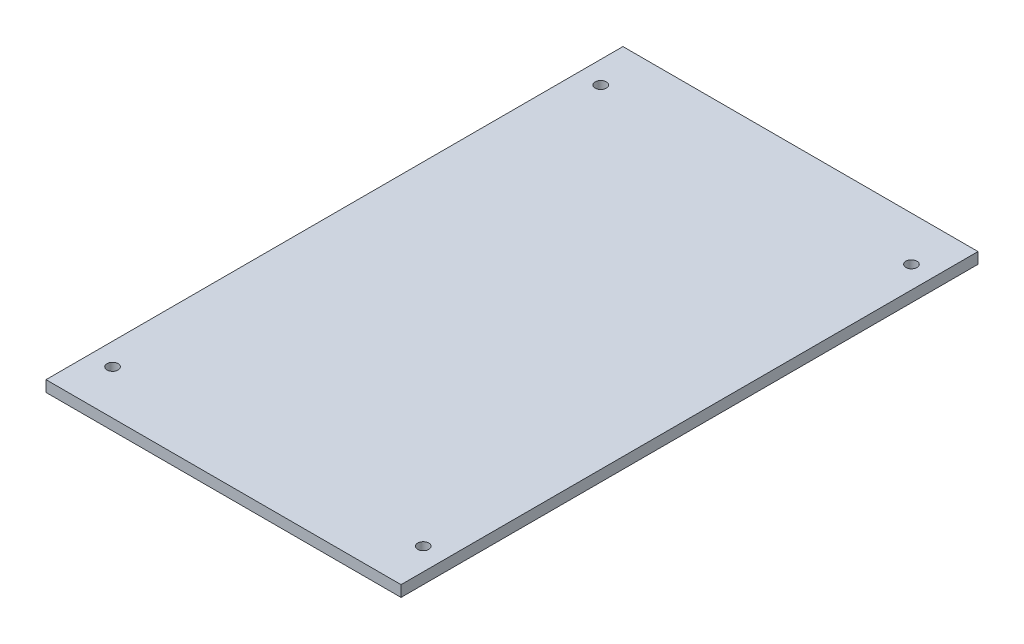
ISO-10303-21;
HEADER;
FILE_DESCRIPTION(('STEP AP214'),'2;1');
FILE_NAME('part.step','',(''),(''),'','','');
FILE_SCHEMA(('AUTOMOTIVE_DESIGN { 1 0 10303 214 1 1 1 1 }'));
ENDSEC;
DATA;
#1=APPLICATION_CONTEXT('core data for automotive mechanical design processes');
#2=APPLICATION_PROTOCOL_DEFINITION('international standard','automotive_design',2000,#1);
#3=PRODUCT_CONTEXT('',#1,'mechanical');
#4=PRODUCT('Part','Part','',(#3));
#5=PRODUCT_RELATED_PRODUCT_CATEGORY('part','',(#4));
#6=PRODUCT_DEFINITION_FORMATION('','',#4);
#7=PRODUCT_DEFINITION_CONTEXT('part definition',#1,'design');
#8=PRODUCT_DEFINITION('design','',#6,#7);
#9=PRODUCT_DEFINITION_SHAPE('','',#8);
#10=(LENGTH_UNIT() NAMED_UNIT(*) SI_UNIT(.MILLI.,.METRE.));
#11=(NAMED_UNIT(*) PLANE_ANGLE_UNIT() SI_UNIT($,.RADIAN.));
#12=(NAMED_UNIT(*) SI_UNIT($,.STERADIAN.) SOLID_ANGLE_UNIT());
#13=UNCERTAINTY_MEASURE_WITH_UNIT(LENGTH_MEASURE(1.E-05),#10,'distance_accuracy_value','');
#14=(GEOMETRIC_REPRESENTATION_CONTEXT(3) GLOBAL_UNCERTAINTY_ASSIGNED_CONTEXT((#13)) GLOBAL_UNIT_ASSIGNED_CONTEXT((#10,
#11,#12)) REPRESENTATION_CONTEXT('',''));
#15=CARTESIAN_POINT('',(0.,0.,0.));
#16=DIRECTION('',(0.,0.,1.));
#17=DIRECTION('',(1.,0.,0.));
#18=AXIS2_PLACEMENT_3D('',#15,#16,#17);
#19=CARTESIAN_POINT('',(101.6,6.35,-165.1));
#20=DIRECTION('',(-1.,0.,0.));
#21=DIRECTION('',(0.,0.,1.));
#22=AXIS2_PLACEMENT_3D('',#19,#20,#21);
#23=PLANE('',#22);
#24=DIRECTION('',(0.,0.,-1.));
#25=VECTOR('',#24,1.);
#26=CARTESIAN_POINT('',(101.6,0.,-165.1));
#27=LINE('',#26,#25);
#28=CARTESIAN_POINT('',(101.6,0.,165.1));
#29=VERTEX_POINT('',#28);
#30=CARTESIAN_POINT('',(101.6,0.,-165.1));
#31=VERTEX_POINT('',#30);
#32=EDGE_CURVE('E106',#29,#31,#27,.T.);
#33=ORIENTED_EDGE('',*,*,#32,.T.);
#34=DIRECTION('',(0.,-1.,0.));
#35=VECTOR('',#34,1.);
#36=CARTESIAN_POINT('',(101.6,6.35,-165.1));
#37=LINE('',#36,#35);
#38=CARTESIAN_POINT('',(101.6,6.35,-165.1));
#39=VERTEX_POINT('',#38);
#40=EDGE_CURVE('E11',#39,#31,#37,.T.);
#41=ORIENTED_EDGE('',*,*,#40,.F.);
#42=DIRECTION('',(0.,0.,-1.));
#43=VECTOR('',#42,1.);
#44=CARTESIAN_POINT('',(101.6,6.35,-165.1));
#45=LINE('',#44,#43);
#46=CARTESIAN_POINT('',(101.6,6.35,165.1));
#47=VERTEX_POINT('',#46);
#48=EDGE_CURVE('E94',#47,#39,#45,.T.);
#49=ORIENTED_EDGE('',*,*,#48,.F.);
#50=DIRECTION('',(0.,-1.,0.));
#51=VECTOR('',#50,1.);
#52=CARTESIAN_POINT('',(101.6,6.35,165.1));
#53=LINE('',#52,#51);
#54=EDGE_CURVE('E102',#47,#29,#53,.T.);
#55=ORIENTED_EDGE('',*,*,#54,.T.);
#56=EDGE_LOOP('',(#33,#41,#49,#55));
#57=FACE_BOUND('',#56,.T.);
#58=ADVANCED_FACE('F43',(#57),#23,.F.);
#59=CARTESIAN_POINT('',(-101.6,6.35,-165.1));
#60=DIRECTION('',(0.,0.,1.));
#61=DIRECTION('',(1.,0.,0.));
#62=AXIS2_PLACEMENT_3D('',#59,#60,#61);
#63=PLANE('',#62);
#64=DIRECTION('',(-1.,0.,0.));
#65=VECTOR('',#64,1.);
#66=CARTESIAN_POINT('',(-101.6,0.,-165.1));
#67=LINE('',#66,#65);
#68=CARTESIAN_POINT('',(-101.6,0.,-165.1));
#69=VERTEX_POINT('',#68);
#70=EDGE_CURVE('E98',#31,#69,#67,.T.);
#71=ORIENTED_EDGE('',*,*,#70,.T.);
#72=DIRECTION('',(0.,-1.,0.));
#73=VECTOR('',#72,1.);
#74=CARTESIAN_POINT('',(-101.6,6.35,-165.1));
#75=LINE('',#74,#73);
#76=CARTESIAN_POINT('',(-101.6,6.35,-165.1));
#77=VERTEX_POINT('',#76);
#78=EDGE_CURVE('E51',#77,#69,#75,.T.);
#79=ORIENTED_EDGE('',*,*,#78,.F.);
#80=DIRECTION('',(-1.,0.,0.));
#81=VECTOR('',#80,1.);
#82=CARTESIAN_POINT('',(-101.6,6.35,-165.1));
#83=LINE('',#82,#81);
#84=EDGE_CURVE('E89',#39,#77,#83,.T.);
#85=ORIENTED_EDGE('',*,*,#84,.F.);
#86=ORIENTED_EDGE('',*,*,#40,.T.);
#87=EDGE_LOOP('',(#71,#79,#85,#86));
#88=FACE_BOUND('',#87,.T.);
#89=ADVANCED_FACE('F97',(#88),#63,.F.);
#90=CARTESIAN_POINT('',(-101.6,6.35,-165.1));
#91=DIRECTION('',(1.,0.,0.));
#92=DIRECTION('',(0.,0.,-1.));
#93=AXIS2_PLACEMENT_3D('',#90,#91,#92);
#94=PLANE('',#93);
#95=DIRECTION('',(0.,0.,1.));
#96=VECTOR('',#95,1.);
#97=CARTESIAN_POINT('',(-101.6,0.,-165.1));
#98=LINE('',#97,#96);
#99=CARTESIAN_POINT('',(-101.6,0.,165.1));
#100=VERTEX_POINT('',#99);
#101=EDGE_CURVE('E76',#69,#100,#98,.T.);
#102=ORIENTED_EDGE('',*,*,#101,.T.);
#103=DIRECTION('',(0.,-1.,0.));
#104=VECTOR('',#103,1.);
#105=CARTESIAN_POINT('',(-101.6,6.35,165.1));
#106=LINE('',#105,#104);
#107=CARTESIAN_POINT('',(-101.6,6.35,165.1));
#108=VERTEX_POINT('',#107);
#109=EDGE_CURVE('E99',#108,#100,#106,.T.);
#110=ORIENTED_EDGE('',*,*,#109,.F.);
#111=DIRECTION('',(0.,0.,1.));
#112=VECTOR('',#111,1.);
#113=CARTESIAN_POINT('',(-101.6,6.35,-165.1));
#114=LINE('',#113,#112);
#115=EDGE_CURVE('E92',#77,#108,#114,.T.);
#116=ORIENTED_EDGE('',*,*,#115,.F.);
#117=ORIENTED_EDGE('',*,*,#78,.T.);
#118=EDGE_LOOP('',(#102,#110,#116,#117));
#119=FACE_BOUND('',#118,.T.);
#120=ADVANCED_FACE('F100',(#119),#94,.F.);
#121=CARTESIAN_POINT('',(-101.6,6.35,165.1));
#122=DIRECTION('',(0.,0.,-1.));
#123=DIRECTION('',(-1.,0.,0.));
#124=AXIS2_PLACEMENT_3D('',#121,#122,#123);
#125=PLANE('',#124);
#126=DIRECTION('',(1.,0.,0.));
#127=VECTOR('',#126,1.);
#128=CARTESIAN_POINT('',(-101.6,0.,165.1));
#129=LINE('',#128,#127);
#130=EDGE_CURVE('E82',#100,#29,#129,.T.);
#131=ORIENTED_EDGE('',*,*,#130,.T.);
#132=ORIENTED_EDGE('',*,*,#54,.F.);
#133=DIRECTION('',(1.,0.,0.));
#134=VECTOR('',#133,1.);
#135=CARTESIAN_POINT('',(-101.6,6.35,165.1));
#136=LINE('',#135,#134);
#137=EDGE_CURVE('E59',#108,#47,#136,.T.);
#138=ORIENTED_EDGE('',*,*,#137,.F.);
#139=ORIENTED_EDGE('',*,*,#109,.T.);
#140=EDGE_LOOP('',(#131,#132,#138,#139));
#141=FACE_BOUND('',#140,.T.);
#142=ADVANCED_FACE('F114',(#141),#125,.F.);
#143=CARTESIAN_POINT('',(0.,6.35,0.));
#144=DIRECTION('',(0.,1.,0.));
#145=DIRECTION('',(0.,0.,1.));
#146=AXIS2_PLACEMENT_3D('',#143,#144,#145);
#147=PLANE('',#146);
#148=CARTESIAN_POINT('',(-88.9,6.35,-139.7));
#149=DIRECTION('',(0.,1.,0.));
#150=DIRECTION('',(0.,0.,1.));
#151=AXIS2_PLACEMENT_3D('',#148,#149,#150);
#152=CIRCLE('',#151,3.175);
#153=CARTESIAN_POINT('',(-88.9,6.35,-136.525));
#154=VERTEX_POINT('',#153);
#155=EDGE_CURVE('E109',#154,#154,#152,.T.);
#156=ORIENTED_EDGE('',*,*,#155,.F.);
#157=EDGE_LOOP('',(#156));
#158=FACE_BOUND('',#157,.T.);
#159=CARTESIAN_POINT('',(88.9,6.35,139.7));
#160=DIRECTION('',(0.,1.,0.));
#161=DIRECTION('',(0.,0.,1.));
#162=AXIS2_PLACEMENT_3D('',#159,#160,#161);
#163=CIRCLE('',#162,3.175);
#164=CARTESIAN_POINT('',(88.9,6.35,142.875));
#165=VERTEX_POINT('',#164);
#166=EDGE_CURVE('E122',#165,#165,#163,.T.);
#167=ORIENTED_EDGE('',*,*,#166,.F.);
#168=EDGE_LOOP('',(#167));
#169=FACE_BOUND('',#168,.T.);
#170=CARTESIAN_POINT('',(-88.9,6.35,139.7));
#171=DIRECTION('',(0.,1.,0.));
#172=DIRECTION('',(0.,0.,1.));
#173=AXIS2_PLACEMENT_3D('',#170,#171,#172);
#174=CIRCLE('',#173,3.175);
#175=CARTESIAN_POINT('',(-88.9,6.35,142.875));
#176=VERTEX_POINT('',#175);
#177=EDGE_CURVE('E125',#176,#176,#174,.T.);
#178=ORIENTED_EDGE('',*,*,#177,.F.);
#179=EDGE_LOOP('',(#178));
#180=FACE_BOUND('',#179,.T.);
#181=CARTESIAN_POINT('',(88.9,6.35,-139.7));
#182=DIRECTION('',(0.,1.,0.));
#183=DIRECTION('',(0.,0.,1.));
#184=AXIS2_PLACEMENT_3D('',#181,#182,#183);
#185=CIRCLE('',#184,3.175);
#186=CARTESIAN_POINT('',(88.9,6.35,-136.525));
#187=VERTEX_POINT('',#186);
#188=EDGE_CURVE('E128',#187,#187,#185,.T.);
#189=ORIENTED_EDGE('',*,*,#188,.F.);
#190=EDGE_LOOP('',(#189));
#191=FACE_BOUND('',#190,.T.);
#192=ORIENTED_EDGE('',*,*,#48,.T.);
#193=ORIENTED_EDGE('',*,*,#84,.T.);
#194=ORIENTED_EDGE('',*,*,#115,.T.);
#195=ORIENTED_EDGE('',*,*,#137,.T.);
#196=EDGE_LOOP('',(#192,#193,#194,#195));
#197=FACE_BOUND('',#196,.T.);
#198=ADVANCED_FACE('F90',(#158,#169,#180,#191,#197),#147,.T.);
#199=CARTESIAN_POINT('',(0.,0.,0.));
#200=DIRECTION('',(0.,1.,0.));
#201=DIRECTION('',(0.,0.,1.));
#202=AXIS2_PLACEMENT_3D('',#199,#200,#201);
#203=PLANE('',#202);
#204=CARTESIAN_POINT('',(-88.9,0.,-139.7));
#205=DIRECTION('',(0.,1.,0.));
#206=DIRECTION('',(0.,0.,1.));
#207=AXIS2_PLACEMENT_3D('',#204,#205,#206);
#208=CIRCLE('',#207,3.175);
#209=CARTESIAN_POINT('',(-88.9,0.,-136.525));
#210=VERTEX_POINT('',#209);
#211=EDGE_CURVE('E134',#210,#210,#208,.T.);
#212=ORIENTED_EDGE('',*,*,#211,.T.);
#213=EDGE_LOOP('',(#212));
#214=FACE_BOUND('',#213,.T.);
#215=CARTESIAN_POINT('',(88.9,0.,139.7));
#216=DIRECTION('',(0.,1.,0.));
#217=DIRECTION('',(0.,0.,1.));
#218=AXIS2_PLACEMENT_3D('',#215,#216,#217);
#219=CIRCLE('',#218,3.175);
#220=CARTESIAN_POINT('',(88.9,0.,142.875));
#221=VERTEX_POINT('',#220);
#222=EDGE_CURVE('E135',#221,#221,#219,.T.);
#223=ORIENTED_EDGE('',*,*,#222,.T.);
#224=EDGE_LOOP('',(#223));
#225=FACE_BOUND('',#224,.T.);
#226=CARTESIAN_POINT('',(-88.9,0.,139.7));
#227=DIRECTION('',(0.,1.,0.));
#228=DIRECTION('',(0.,0.,1.));
#229=AXIS2_PLACEMENT_3D('',#226,#227,#228);
#230=CIRCLE('',#229,3.175);
#231=CARTESIAN_POINT('',(-88.9,0.,142.875));
#232=VERTEX_POINT('',#231);
#233=EDGE_CURVE('E138',#232,#232,#230,.T.);
#234=ORIENTED_EDGE('',*,*,#233,.T.);
#235=EDGE_LOOP('',(#234));
#236=FACE_BOUND('',#235,.T.);
#237=CARTESIAN_POINT('',(88.9,0.,-139.7));
#238=DIRECTION('',(0.,1.,0.));
#239=DIRECTION('',(0.,0.,1.));
#240=AXIS2_PLACEMENT_3D('',#237,#238,#239);
#241=CIRCLE('',#240,3.175);
#242=CARTESIAN_POINT('',(88.9,0.,-136.525));
#243=VERTEX_POINT('',#242);
#244=EDGE_CURVE('E131',#243,#243,#241,.T.);
#245=ORIENTED_EDGE('',*,*,#244,.T.);
#246=EDGE_LOOP('',(#245));
#247=FACE_BOUND('',#246,.T.);
#248=ORIENTED_EDGE('',*,*,#32,.F.);
#249=ORIENTED_EDGE('',*,*,#130,.F.);
#250=ORIENTED_EDGE('',*,*,#101,.F.);
#251=ORIENTED_EDGE('',*,*,#70,.F.);
#252=EDGE_LOOP('',(#248,#249,#250,#251));
#253=FACE_BOUND('',#252,.T.);
#254=ADVANCED_FACE('F117',(#214,#225,#236,#247,#253),#203,.F.);
#255=CARTESIAN_POINT('',(88.9,0.,-139.7));
#256=DIRECTION('',(0.,1.,0.));
#257=DIRECTION('',(0.,0.,1.));
#258=AXIS2_PLACEMENT_3D('',#255,#256,#257);
#259=CYLINDRICAL_SURFACE('',#258,3.175);
#260=ORIENTED_EDGE('',*,*,#188,.T.);
#261=EDGE_LOOP('',(#260));
#262=FACE_BOUND('',#261,.T.);
#263=ORIENTED_EDGE('',*,*,#244,.F.);
#264=EDGE_LOOP('',(#263));
#265=FACE_BOUND('',#264,.T.);
#266=ADVANCED_FACE('F149',(#262,#265),#259,.F.);
#267=CARTESIAN_POINT('',(-88.9,0.,139.7));
#268=DIRECTION('',(0.,1.,0.));
#269=DIRECTION('',(0.,0.,1.));
#270=AXIS2_PLACEMENT_3D('',#267,#268,#269);
#271=CYLINDRICAL_SURFACE('',#270,3.175);
#272=ORIENTED_EDGE('',*,*,#177,.T.);
#273=EDGE_LOOP('',(#272));
#274=FACE_BOUND('',#273,.T.);
#275=ORIENTED_EDGE('',*,*,#233,.F.);
#276=EDGE_LOOP('',(#275));
#277=FACE_BOUND('',#276,.T.);
#278=ADVANCED_FACE('F146',(#274,#277),#271,.F.);
#279=CARTESIAN_POINT('',(88.9,0.,139.7));
#280=DIRECTION('',(0.,1.,0.));
#281=DIRECTION('',(0.,0.,1.));
#282=AXIS2_PLACEMENT_3D('',#279,#280,#281);
#283=CYLINDRICAL_SURFACE('',#282,3.175);
#284=ORIENTED_EDGE('',*,*,#166,.T.);
#285=EDGE_LOOP('',(#284));
#286=FACE_BOUND('',#285,.T.);
#287=ORIENTED_EDGE('',*,*,#222,.F.);
#288=EDGE_LOOP('',(#287));
#289=FACE_BOUND('',#288,.T.);
#290=ADVANCED_FACE('F148',(#286,#289),#283,.F.);
#291=CARTESIAN_POINT('',(-88.9,0.,-139.7));
#292=DIRECTION('',(0.,1.,0.));
#293=DIRECTION('',(0.,0.,1.));
#294=AXIS2_PLACEMENT_3D('',#291,#292,#293);
#295=CYLINDRICAL_SURFACE('',#294,3.175);
#296=ORIENTED_EDGE('',*,*,#155,.T.);
#297=EDGE_LOOP('',(#296));
#298=FACE_BOUND('',#297,.T.);
#299=ORIENTED_EDGE('',*,*,#211,.F.);
#300=EDGE_LOOP('',(#299));
#301=FACE_BOUND('',#300,.T.);
#302=ADVANCED_FACE('F156',(#298,#301),#295,.F.);
#303=CLOSED_SHELL('',(#58,#89,#120,#142,#198,#254,#266,#278,#290,#302));
#304=MANIFOLD_SOLID_BREP('B2',#303);
#305=ADVANCED_BREP_SHAPE_REPRESENTATION('',(#18,#304),#14);
#306=SHAPE_DEFINITION_REPRESENTATION(#9,#305);
ENDSEC;
END-ISO-10303-21;
